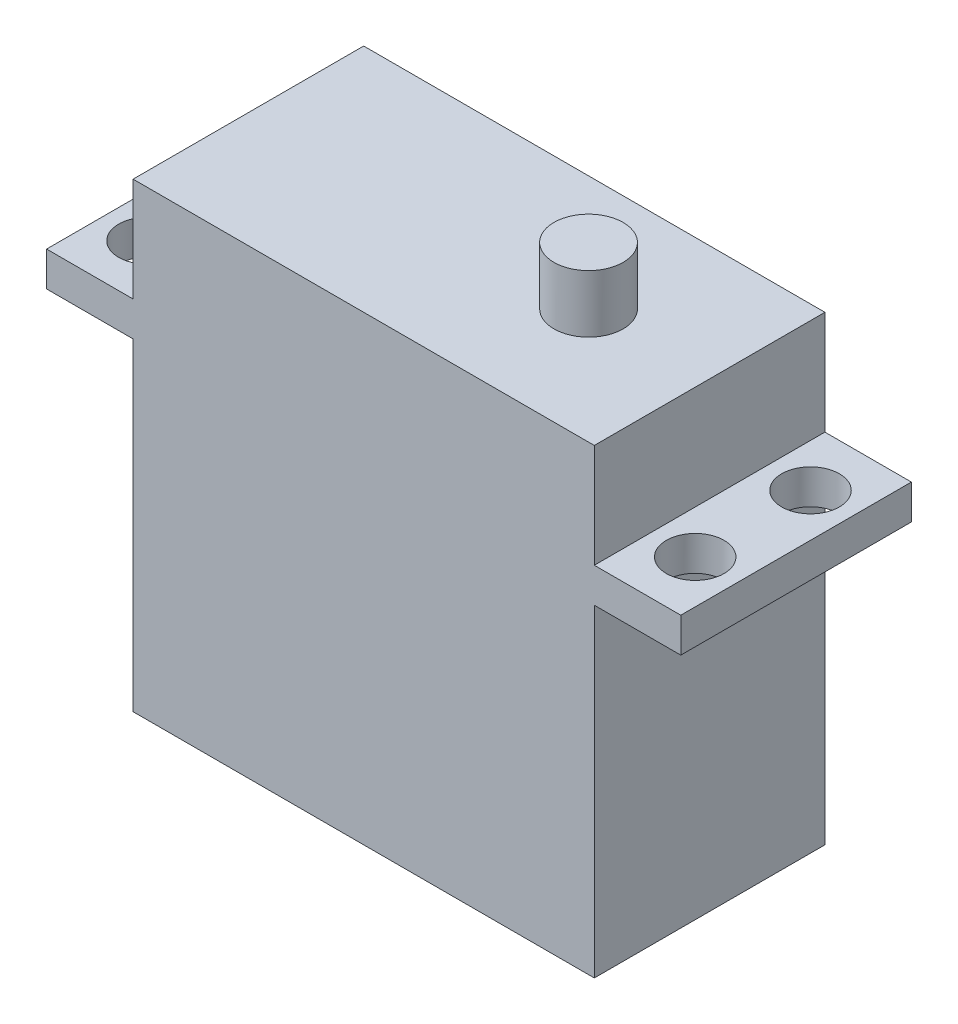
ISO-10303-21;
HEADER;
FILE_DESCRIPTION(('STEP AP214'),'2;1');
FILE_NAME('part.step','',(''),(''),'','','');
FILE_SCHEMA(('AUTOMOTIVE_DESIGN { 1 0 10303 214 1 1 1 1 }'));
ENDSEC;
DATA;
#1=APPLICATION_CONTEXT('core data for automotive mechanical design processes');
#2=APPLICATION_PROTOCOL_DEFINITION('international standard','automotive_design',2000,#1);
#3=PRODUCT_CONTEXT('',#1,'mechanical');
#4=PRODUCT('Part','Part','',(#3));
#5=PRODUCT_RELATED_PRODUCT_CATEGORY('part','',(#4));
#6=PRODUCT_DEFINITION_FORMATION('','',#4);
#7=PRODUCT_DEFINITION_CONTEXT('part definition',#1,'design');
#8=PRODUCT_DEFINITION('design','',#6,#7);
#9=PRODUCT_DEFINITION_SHAPE('','',#8);
#10=(LENGTH_UNIT() NAMED_UNIT(*) SI_UNIT(.MILLI.,.METRE.));
#11=(NAMED_UNIT(*) PLANE_ANGLE_UNIT() SI_UNIT($,.RADIAN.));
#12=(NAMED_UNIT(*) SI_UNIT($,.STERADIAN.) SOLID_ANGLE_UNIT());
#13=UNCERTAINTY_MEASURE_WITH_UNIT(LENGTH_MEASURE(1.E-05),#10,'distance_accuracy_value','');
#14=(GEOMETRIC_REPRESENTATION_CONTEXT(3) GLOBAL_UNCERTAINTY_ASSIGNED_CONTEXT((#13)) GLOBAL_UNIT_ASSIGNED_CONTEXT((#10,
#11,#12)) REPRESENTATION_CONTEXT('',''));
#15=CARTESIAN_POINT('',(0.,0.,0.));
#16=DIRECTION('',(0.,0.,1.));
#17=DIRECTION('',(1.,0.,0.));
#18=AXIS2_PLACEMENT_3D('',#15,#16,#17);
#19=CARTESIAN_POINT('',(20.,-20.,20.));
#20=DIRECTION('',(-1.,0.,0.));
#21=DIRECTION('',(0.,0.,1.));
#22=AXIS2_PLACEMENT_3D('',#19,#20,#21);
#23=PLANE('',#22);
#24=DIRECTION('',(0.,1.,0.));
#25=VECTOR('',#24,1.);
#26=CARTESIAN_POINT('',(20.,-20.,0.));
#27=LINE('',#26,#25);
#28=CARTESIAN_POINT('',(20.,-20.,0.));
#29=VERTEX_POINT('',#28);
#30=CARTESIAN_POINT('',(20.,8.,0.));
#31=VERTEX_POINT('',#30);
#32=EDGE_CURVE('E253',#29,#31,#27,.T.);
#33=ORIENTED_EDGE('',*,*,#32,.T.);
#34=DIRECTION('',(0.,0.,1.));
#35=VECTOR('',#34,1.);
#36=CARTESIAN_POINT('',(20.,8.,0.));
#37=LINE('',#36,#35);
#38=CARTESIAN_POINT('',(20.,8.,20.));
#39=VERTEX_POINT('',#38);
#40=EDGE_CURVE('E157',#31,#39,#37,.T.);
#41=ORIENTED_EDGE('',*,*,#40,.T.);
#42=DIRECTION('',(0.,1.,0.));
#43=VECTOR('',#42,1.);
#44=CARTESIAN_POINT('',(20.,-20.,20.));
#45=LINE('',#44,#43);
#46=CARTESIAN_POINT('',(20.,-20.,20.));
#47=VERTEX_POINT('',#46);
#48=EDGE_CURVE('E237',#47,#39,#45,.T.);
#49=ORIENTED_EDGE('',*,*,#48,.F.);
#50=DIRECTION('',(0.,0.,-1.));
#51=VECTOR('',#50,1.);
#52=CARTESIAN_POINT('',(20.,-20.,20.));
#53=LINE('',#52,#51);
#54=EDGE_CURVE('E252',#47,#29,#53,.T.);
#55=ORIENTED_EDGE('',*,*,#54,.T.);
#56=EDGE_LOOP('',(#33,#41,#49,#55));
#57=FACE_BOUND('',#56,.T.);
#58=ADVANCED_FACE('F43',(#57),#23,.F.);
#59=CARTESIAN_POINT('',(-20.,-20.,20.));
#60=DIRECTION('',(1.,0.,0.));
#61=DIRECTION('',(0.,0.,-1.));
#62=AXIS2_PLACEMENT_3D('',#59,#60,#61);
#63=PLANE('',#62);
#64=DIRECTION('',(0.,0.,-1.));
#65=VECTOR('',#64,1.);
#66=CARTESIAN_POINT('',(-20.,11.,0.));
#67=LINE('',#66,#65);
#68=CARTESIAN_POINT('',(-20.,11.,20.));
#69=VERTEX_POINT('',#68);
#70=CARTESIAN_POINT('',(-20.,11.,0.));
#71=VERTEX_POINT('',#70);
#72=EDGE_CURVE('E69',#69,#71,#67,.T.);
#73=ORIENTED_EDGE('',*,*,#72,.F.);
#74=DIRECTION('',(0.,-1.,0.));
#75=VECTOR('',#74,1.);
#76=CARTESIAN_POINT('',(-20.,-20.,20.));
#77=LINE('',#76,#75);
#78=CARTESIAN_POINT('',(-20.,20.,20.));
#79=VERTEX_POINT('',#78);
#80=EDGE_CURVE('E246',#79,#69,#77,.T.);
#81=ORIENTED_EDGE('',*,*,#80,.F.);
#82=DIRECTION('',(0.,0.,-1.));
#83=VECTOR('',#82,1.);
#84=CARTESIAN_POINT('',(-20.,20.,20.));
#85=LINE('',#84,#83);
#86=CARTESIAN_POINT('',(-20.,20.,0.));
#87=VERTEX_POINT('',#86);
#88=EDGE_CURVE('E274',#79,#87,#85,.T.);
#89=ORIENTED_EDGE('',*,*,#88,.T.);
#90=DIRECTION('',(0.,-1.,0.));
#91=VECTOR('',#90,1.);
#92=CARTESIAN_POINT('',(-20.,-20.,0.));
#93=LINE('',#92,#91);
#94=EDGE_CURVE('E261',#87,#71,#93,.T.);
#95=ORIENTED_EDGE('',*,*,#94,.T.);
#96=EDGE_LOOP('',(#73,#81,#89,#95));
#97=FACE_BOUND('',#96,.T.);
#98=ADVANCED_FACE('F313',(#97),#63,.F.);
#99=DIRECTION('',(0.,0.,1.));
#100=VECTOR('',#99,1.);
#101=CARTESIAN_POINT('',(-20.,8.,0.));
#102=LINE('',#101,#100);
#103=CARTESIAN_POINT('',(-20.,8.,0.));
#104=VERTEX_POINT('',#103);
#105=CARTESIAN_POINT('',(-20.,8.,20.));
#106=VERTEX_POINT('',#105);
#107=EDGE_CURVE('E198',#104,#106,#102,.T.);
#108=ORIENTED_EDGE('',*,*,#107,.F.);
#109=CARTESIAN_POINT('',(-20.,-20.,0.));
#110=VERTEX_POINT('',#109);
#111=EDGE_CURVE('E260',#104,#110,#93,.T.);
#112=ORIENTED_EDGE('',*,*,#111,.T.);
#113=DIRECTION('',(0.,0.,-1.));
#114=VECTOR('',#113,1.);
#115=CARTESIAN_POINT('',(-20.,-20.,20.));
#116=LINE('',#115,#114);
#117=CARTESIAN_POINT('',(-20.,-20.,20.));
#118=VERTEX_POINT('',#117);
#119=EDGE_CURVE('E270',#118,#110,#116,.T.);
#120=ORIENTED_EDGE('',*,*,#119,.F.);
#121=EDGE_CURVE('E245',#106,#118,#77,.T.);
#122=ORIENTED_EDGE('',*,*,#121,.F.);
#123=EDGE_LOOP('',(#108,#112,#120,#122));
#124=FACE_BOUND('',#123,.T.);
#125=ADVANCED_FACE('F318',(#124),#63,.F.);
#126=CARTESIAN_POINT('',(20.,11.,20.));
#127=VERTEX_POINT('',#126);
#128=CARTESIAN_POINT('',(20.,20.,20.));
#129=VERTEX_POINT('',#128);
#130=EDGE_CURVE('E242',#127,#129,#45,.T.);
#131=ORIENTED_EDGE('',*,*,#130,.F.);
#132=DIRECTION('',(0.,0.,-1.));
#133=VECTOR('',#132,1.);
#134=CARTESIAN_POINT('',(20.,11.,0.));
#135=LINE('',#134,#133);
#136=CARTESIAN_POINT('',(20.,11.,0.));
#137=VERTEX_POINT('',#136);
#138=EDGE_CURVE('E170',#127,#137,#135,.T.);
#139=ORIENTED_EDGE('',*,*,#138,.T.);
#140=CARTESIAN_POINT('',(20.,20.,0.));
#141=VERTEX_POINT('',#140);
#142=EDGE_CURVE('E143',#137,#141,#27,.T.);
#143=ORIENTED_EDGE('',*,*,#142,.T.);
#144=DIRECTION('',(0.,0.,-1.));
#145=VECTOR('',#144,1.);
#146=CARTESIAN_POINT('',(20.,20.,20.));
#147=LINE('',#146,#145);
#148=EDGE_CURVE('E53',#129,#141,#147,.T.);
#149=ORIENTED_EDGE('',*,*,#148,.F.);
#150=EDGE_LOOP('',(#131,#139,#143,#149));
#151=FACE_BOUND('',#150,.T.);
#152=ADVANCED_FACE('F45',(#151),#23,.F.);
#153=CARTESIAN_POINT('',(-20.,20.,20.));
#154=DIRECTION('',(0.,-1.,0.));
#155=DIRECTION('',(0.,0.,-1.));
#156=AXIS2_PLACEMENT_3D('',#153,#154,#155);
#157=PLANE('',#156);
#158=CARTESIAN_POINT('',(9.5,20.,10.));
#159=DIRECTION('',(0.,-1.,0.));
#160=DIRECTION('',(0.,0.,-1.));
#161=AXIS2_PLACEMENT_3D('',#158,#159,#160);
#162=CIRCLE('',#161,3.);
#163=CARTESIAN_POINT('',(9.5,20.,7.));
#164=VERTEX_POINT('',#163);
#165=EDGE_CURVE('E11',#164,#164,#162,.F.);
#166=ORIENTED_EDGE('',*,*,#165,.F.);
#167=EDGE_LOOP('',(#166));
#168=FACE_BOUND('',#167,.T.);
#169=DIRECTION('',(-1.,0.,0.));
#170=VECTOR('',#169,1.);
#171=CARTESIAN_POINT('',(-20.,20.,0.));
#172=LINE('',#171,#170);
#173=EDGE_CURVE('E257',#141,#87,#172,.T.);
#174=ORIENTED_EDGE('',*,*,#173,.T.);
#175=ORIENTED_EDGE('',*,*,#88,.F.);
#176=DIRECTION('',(-1.,0.,0.));
#177=VECTOR('',#176,1.);
#178=CARTESIAN_POINT('',(-20.,20.,20.));
#179=LINE('',#178,#177);
#180=EDGE_CURVE('E241',#129,#79,#179,.T.);
#181=ORIENTED_EDGE('',*,*,#180,.F.);
#182=ORIENTED_EDGE('',*,*,#148,.T.);
#183=EDGE_LOOP('',(#174,#175,#181,#182));
#184=FACE_BOUND('',#183,.T.);
#185=ADVANCED_FACE('F321',(#168,#184),#157,.F.);
#186=CARTESIAN_POINT('',(-20.,-20.,20.));
#187=DIRECTION('',(0.,1.,0.));
#188=DIRECTION('',(0.,0.,1.));
#189=AXIS2_PLACEMENT_3D('',#186,#187,#188);
#190=PLANE('',#189);
#191=DIRECTION('',(1.,0.,0.));
#192=VECTOR('',#191,1.);
#193=CARTESIAN_POINT('',(-20.,-20.,0.));
#194=LINE('',#193,#192);
#195=EDGE_CURVE('E264',#110,#29,#194,.T.);
#196=ORIENTED_EDGE('',*,*,#195,.T.);
#197=ORIENTED_EDGE('',*,*,#54,.F.);
#198=DIRECTION('',(1.,0.,0.));
#199=VECTOR('',#198,1.);
#200=CARTESIAN_POINT('',(-20.,-20.,20.));
#201=LINE('',#200,#199);
#202=EDGE_CURVE('E249',#118,#47,#201,.T.);
#203=ORIENTED_EDGE('',*,*,#202,.F.);
#204=ORIENTED_EDGE('',*,*,#119,.T.);
#205=EDGE_LOOP('',(#196,#197,#203,#204));
#206=FACE_BOUND('',#205,.T.);
#207=ADVANCED_FACE('F327',(#206),#190,.F.);
#208=CARTESIAN_POINT('',(0.,0.,20.));
#209=DIRECTION('',(0.,0.,-1.));
#210=DIRECTION('',(-1.,0.,0.));
#211=AXIS2_PLACEMENT_3D('',#208,#209,#210);
#212=PLANE('',#211);
#213=ORIENTED_EDGE('',*,*,#48,.T.);
#214=DIRECTION('',(-1.,0.,0.));
#215=VECTOR('',#214,1.);
#216=CARTESIAN_POINT('',(27.5,8.,20.));
#217=LINE('',#216,#215);
#218=CARTESIAN_POINT('',(27.5,8.,20.));
#219=VERTEX_POINT('',#218);
#220=EDGE_CURVE('E178',#219,#39,#217,.T.);
#221=ORIENTED_EDGE('',*,*,#220,.F.);
#222=DIRECTION('',(0.,1.,0.));
#223=VECTOR('',#222,1.);
#224=CARTESIAN_POINT('',(27.5,11.,20.));
#225=LINE('',#224,#223);
#226=CARTESIAN_POINT('',(27.5,11.,20.));
#227=VERTEX_POINT('',#226);
#228=EDGE_CURVE('E161',#219,#227,#225,.T.);
#229=ORIENTED_EDGE('',*,*,#228,.T.);
#230=DIRECTION('',(-1.,0.,0.));
#231=VECTOR('',#230,1.);
#232=CARTESIAN_POINT('',(27.5,11.,20.));
#233=LINE('',#232,#231);
#234=EDGE_CURVE('E146',#227,#127,#233,.T.);
#235=ORIENTED_EDGE('',*,*,#234,.T.);
#236=ORIENTED_EDGE('',*,*,#130,.T.);
#237=ORIENTED_EDGE('',*,*,#180,.T.);
#238=ORIENTED_EDGE('',*,*,#80,.T.);
#239=DIRECTION('',(1.,0.,0.));
#240=VECTOR('',#239,1.);
#241=CARTESIAN_POINT('',(-27.5,11.,20.));
#242=LINE('',#241,#240);
#243=CARTESIAN_POINT('',(-27.5,11.,20.));
#244=VERTEX_POINT('',#243);
#245=EDGE_CURVE('E221',#244,#69,#242,.T.);
#246=ORIENTED_EDGE('',*,*,#245,.F.);
#247=DIRECTION('',(0.,1.,0.));
#248=VECTOR('',#247,1.);
#249=CARTESIAN_POINT('',(-27.5,11.,20.));
#250=LINE('',#249,#248);
#251=CARTESIAN_POINT('',(-27.5,8.,20.));
#252=VERTEX_POINT('',#251);
#253=EDGE_CURVE('E206',#252,#244,#250,.T.);
#254=ORIENTED_EDGE('',*,*,#253,.F.);
#255=DIRECTION('',(1.,0.,0.));
#256=VECTOR('',#255,1.);
#257=CARTESIAN_POINT('',(-27.5,8.,20.));
#258=LINE('',#257,#256);
#259=EDGE_CURVE('E225',#252,#106,#258,.T.);
#260=ORIENTED_EDGE('',*,*,#259,.T.);
#261=ORIENTED_EDGE('',*,*,#121,.T.);
#262=ORIENTED_EDGE('',*,*,#202,.T.);
#263=EDGE_LOOP('',(#213,#221,#229,#235,#236,#237,#238,#246,#254,#260,#261,#262));
#264=FACE_BOUND('',#263,.T.);
#265=ADVANCED_FACE('F340',(#264),#212,.F.);
#266=CARTESIAN_POINT('',(0.,0.,0.));
#267=DIRECTION('',(0.,0.,-1.));
#268=DIRECTION('',(-1.,0.,0.));
#269=AXIS2_PLACEMENT_3D('',#266,#267,#268);
#270=PLANE('',#269);
#271=ORIENTED_EDGE('',*,*,#32,.F.);
#272=ORIENTED_EDGE('',*,*,#195,.F.);
#273=ORIENTED_EDGE('',*,*,#111,.F.);
#274=DIRECTION('',(1.,0.,0.));
#275=VECTOR('',#274,1.);
#276=CARTESIAN_POINT('',(-27.5,8.,0.));
#277=LINE('',#276,#275);
#278=CARTESIAN_POINT('',(-27.5,8.,0.));
#279=VERTEX_POINT('',#278);
#280=EDGE_CURVE('E229',#279,#104,#277,.T.);
#281=ORIENTED_EDGE('',*,*,#280,.F.);
#282=DIRECTION('',(0.,-1.,0.));
#283=VECTOR('',#282,1.);
#284=CARTESIAN_POINT('',(-27.5,11.,0.));
#285=LINE('',#284,#283);
#286=CARTESIAN_POINT('',(-27.5,11.,0.));
#287=VERTEX_POINT('',#286);
#288=EDGE_CURVE('E199',#287,#279,#285,.T.);
#289=ORIENTED_EDGE('',*,*,#288,.F.);
#290=DIRECTION('',(1.,0.,0.));
#291=VECTOR('',#290,1.);
#292=CARTESIAN_POINT('',(-27.5,11.,0.));
#293=LINE('',#292,#291);
#294=EDGE_CURVE('E212',#287,#71,#293,.T.);
#295=ORIENTED_EDGE('',*,*,#294,.T.);
#296=ORIENTED_EDGE('',*,*,#94,.F.);
#297=ORIENTED_EDGE('',*,*,#173,.F.);
#298=ORIENTED_EDGE('',*,*,#142,.F.);
#299=DIRECTION('',(-1.,0.,0.));
#300=VECTOR('',#299,1.);
#301=CARTESIAN_POINT('',(27.5,11.,0.));
#302=LINE('',#301,#300);
#303=CARTESIAN_POINT('',(27.5,11.,0.));
#304=VERTEX_POINT('',#303);
#305=EDGE_CURVE('E61',#304,#137,#302,.T.);
#306=ORIENTED_EDGE('',*,*,#305,.F.);
#307=DIRECTION('',(0.,-1.,0.));
#308=VECTOR('',#307,1.);
#309=CARTESIAN_POINT('',(27.5,11.,0.));
#310=LINE('',#309,#308);
#311=CARTESIAN_POINT('',(27.5,8.,0.));
#312=VERTEX_POINT('',#311);
#313=EDGE_CURVE('E140',#304,#312,#310,.T.);
#314=ORIENTED_EDGE('',*,*,#313,.T.);
#315=DIRECTION('',(-1.,0.,0.));
#316=VECTOR('',#315,1.);
#317=CARTESIAN_POINT('',(27.5,8.,0.));
#318=LINE('',#317,#316);
#319=EDGE_CURVE('E169',#312,#31,#318,.T.);
#320=ORIENTED_EDGE('',*,*,#319,.T.);
#321=EDGE_LOOP('',(#271,#272,#273,#281,#289,#295,#296,#297,#298,#306,#314,#320));
#322=FACE_BOUND('',#321,.T.);
#323=ADVANCED_FACE('F139',(#322),#270,.T.);
#324=CARTESIAN_POINT('',(9.5,25.,10.));
#325=DIRECTION('',(0.,-1.,0.));
#326=DIRECTION('',(0.,0.,-1.));
#327=AXIS2_PLACEMENT_3D('',#324,#325,#326);
#328=CYLINDRICAL_SURFACE('',#327,3.);
#329=CARTESIAN_POINT('',(9.5,25.,10.));
#330=DIRECTION('',(0.,1.,0.));
#331=DIRECTION('',(0.,0.,1.));
#332=AXIS2_PLACEMENT_3D('',#329,#330,#331);
#333=CIRCLE('',#332,3.);
#334=CARTESIAN_POINT('',(9.5,25.,13.));
#335=VERTEX_POINT('',#334);
#336=EDGE_CURVE('E233',#335,#335,#333,.T.);
#337=ORIENTED_EDGE('',*,*,#336,.F.);
#338=EDGE_LOOP('',(#337));
#339=FACE_BOUND('',#338,.T.);
#340=ORIENTED_EDGE('',*,*,#165,.T.);
#341=EDGE_LOOP('',(#340));
#342=FACE_BOUND('',#341,.T.);
#343=ADVANCED_FACE('F390',(#339,#342),#328,.T.);
#344=CARTESIAN_POINT('',(9.5,25.,10.));
#345=DIRECTION('',(0.,1.,0.));
#346=DIRECTION('',(0.,0.,1.));
#347=AXIS2_PLACEMENT_3D('',#344,#345,#346);
#348=PLANE('',#347);
#349=ORIENTED_EDGE('',*,*,#336,.T.);
#350=EDGE_LOOP('',(#349));
#351=FACE_BOUND('',#350,.T.);
#352=ADVANCED_FACE('F386',(#351),#348,.T.);
#353=CARTESIAN_POINT('',(-27.5,8.,0.));
#354=DIRECTION('',(0.,1.,0.));
#355=DIRECTION('',(0.,0.,1.));
#356=AXIS2_PLACEMENT_3D('',#353,#354,#355);
#357=PLANE('',#356);
#358=CARTESIAN_POINT('',(-23.75,8.,5.));
#359=DIRECTION('',(0.,1.,0.));
#360=DIRECTION('',(0.,0.,1.));
#361=AXIS2_PLACEMENT_3D('',#358,#359,#360);
#362=CIRCLE('',#361,2.5);
#363=CARTESIAN_POINT('',(-23.75,8.,7.5));
#364=VERTEX_POINT('',#363);
#365=EDGE_CURVE('E194',#364,#364,#362,.T.);
#366=ORIENTED_EDGE('',*,*,#365,.T.);
#367=EDGE_LOOP('',(#366));
#368=FACE_BOUND('',#367,.T.);
#369=CARTESIAN_POINT('',(-23.75,8.,15.));
#370=DIRECTION('',(0.,1.,0.));
#371=DIRECTION('',(0.,0.,1.));
#372=AXIS2_PLACEMENT_3D('',#369,#370,#371);
#373=CIRCLE('',#372,2.5);
#374=CARTESIAN_POINT('',(-23.75,8.,17.5));
#375=VERTEX_POINT('',#374);
#376=EDGE_CURVE('E187',#375,#375,#373,.T.);
#377=ORIENTED_EDGE('',*,*,#376,.T.);
#378=EDGE_LOOP('',(#377));
#379=FACE_BOUND('',#378,.T.);
#380=ORIENTED_EDGE('',*,*,#107,.T.);
#381=ORIENTED_EDGE('',*,*,#259,.F.);
#382=DIRECTION('',(0.,0.,1.));
#383=VECTOR('',#382,1.);
#384=CARTESIAN_POINT('',(-27.5,8.,0.));
#385=LINE('',#384,#383);
#386=EDGE_CURVE('E203',#279,#252,#385,.T.);
#387=ORIENTED_EDGE('',*,*,#386,.F.);
#388=ORIENTED_EDGE('',*,*,#280,.T.);
#389=EDGE_LOOP('',(#380,#381,#387,#388));
#390=FACE_BOUND('',#389,.T.);
#391=ADVANCED_FACE('F354',(#368,#379,#390),#357,.F.);
#392=CARTESIAN_POINT('',(-27.5,11.,0.));
#393=DIRECTION('',(0.,-1.,0.));
#394=DIRECTION('',(0.,0.,-1.));
#395=AXIS2_PLACEMENT_3D('',#392,#393,#394);
#396=PLANE('',#395);
#397=CARTESIAN_POINT('',(-23.75,11.,5.));
#398=DIRECTION('',(0.,1.,0.));
#399=DIRECTION('',(0.,0.,1.));
#400=AXIS2_PLACEMENT_3D('',#397,#398,#399);
#401=CIRCLE('',#400,2.5);
#402=CARTESIAN_POINT('',(-23.75,11.,7.5));
#403=VERTEX_POINT('',#402);
#404=EDGE_CURVE('E183',#403,#403,#401,.T.);
#405=ORIENTED_EDGE('',*,*,#404,.F.);
#406=EDGE_LOOP('',(#405));
#407=FACE_BOUND('',#406,.T.);
#408=CARTESIAN_POINT('',(-23.75,11.,15.));
#409=DIRECTION('',(0.,1.,0.));
#410=DIRECTION('',(0.,0.,1.));
#411=AXIS2_PLACEMENT_3D('',#408,#409,#410);
#412=CIRCLE('',#411,2.5);
#413=CARTESIAN_POINT('',(-23.75,11.,17.5));
#414=VERTEX_POINT('',#413);
#415=EDGE_CURVE('E145',#414,#414,#412,.T.);
#416=ORIENTED_EDGE('',*,*,#415,.F.);
#417=EDGE_LOOP('',(#416));
#418=FACE_BOUND('',#417,.T.);
#419=ORIENTED_EDGE('',*,*,#72,.T.);
#420=ORIENTED_EDGE('',*,*,#294,.F.);
#421=DIRECTION('',(0.,0.,-1.));
#422=VECTOR('',#421,1.);
#423=CARTESIAN_POINT('',(-27.5,11.,0.));
#424=LINE('',#423,#422);
#425=EDGE_CURVE('E209',#244,#287,#424,.T.);
#426=ORIENTED_EDGE('',*,*,#425,.F.);
#427=ORIENTED_EDGE('',*,*,#245,.T.);
#428=EDGE_LOOP('',(#419,#420,#426,#427));
#429=FACE_BOUND('',#428,.T.);
#430=ADVANCED_FACE('F345',(#407,#418,#429),#396,.F.);
#431=CARTESIAN_POINT('',(-27.5,0.,0.));
#432=DIRECTION('',(-1.,0.,0.));
#433=DIRECTION('',(0.,0.,1.));
#434=AXIS2_PLACEMENT_3D('',#431,#432,#433);
#435=PLANE('',#434);
#436=ORIENTED_EDGE('',*,*,#288,.T.);
#437=ORIENTED_EDGE('',*,*,#386,.T.);
#438=ORIENTED_EDGE('',*,*,#253,.T.);
#439=ORIENTED_EDGE('',*,*,#425,.T.);
#440=EDGE_LOOP('',(#436,#437,#438,#439));
#441=FACE_BOUND('',#440,.T.);
#442=ADVANCED_FACE('F349',(#441),#435,.T.);
#443=CARTESIAN_POINT('',(-23.75,3.5,15.));
#444=DIRECTION('',(0.,1.,0.));
#445=DIRECTION('',(0.,0.,1.));
#446=AXIS2_PLACEMENT_3D('',#443,#444,#445);
#447=CYLINDRICAL_SURFACE('',#446,2.5);
#448=ORIENTED_EDGE('',*,*,#415,.T.);
#449=EDGE_LOOP('',(#448));
#450=FACE_BOUND('',#449,.T.);
#451=ORIENTED_EDGE('',*,*,#376,.F.);
#452=EDGE_LOOP('',(#451));
#453=FACE_BOUND('',#452,.T.);
#454=ADVANCED_FACE('F374',(#450,#453),#447,.F.);
#455=CARTESIAN_POINT('',(-23.75,3.5,5.));
#456=DIRECTION('',(0.,1.,0.));
#457=DIRECTION('',(0.,0.,1.));
#458=AXIS2_PLACEMENT_3D('',#455,#456,#457);
#459=CYLINDRICAL_SURFACE('',#458,2.5);
#460=ORIENTED_EDGE('',*,*,#404,.T.);
#461=EDGE_LOOP('',(#460));
#462=FACE_BOUND('',#461,.T.);
#463=ORIENTED_EDGE('',*,*,#365,.F.);
#464=EDGE_LOOP('',(#463));
#465=FACE_BOUND('',#464,.T.);
#466=ADVANCED_FACE('F369',(#462,#465),#459,.F.);
#467=CARTESIAN_POINT('',(27.5,11.,0.));
#468=DIRECTION('',(0.,1.,0.));
#469=DIRECTION('',(0.,0.,1.));
#470=AXIS2_PLACEMENT_3D('',#467,#468,#469);
#471=PLANE('',#470);
#472=CARTESIAN_POINT('',(23.75,11.,5.));
#473=DIRECTION('',(0.,-1.,0.));
#474=DIRECTION('',(0.,0.,1.));
#475=AXIS2_PLACEMENT_3D('',#472,#473,#474);
#476=CIRCLE('',#475,2.5);
#477=CARTESIAN_POINT('',(23.75,11.,7.5));
#478=VERTEX_POINT('',#477);
#479=EDGE_CURVE('E283',#478,#478,#476,.T.);
#480=ORIENTED_EDGE('',*,*,#479,.T.);
#481=EDGE_LOOP('',(#480));
#482=FACE_BOUND('',#481,.T.);
#483=CARTESIAN_POINT('',(23.75,11.,15.));
#484=DIRECTION('',(0.,-1.,0.));
#485=DIRECTION('',(0.,0.,1.));
#486=AXIS2_PLACEMENT_3D('',#483,#484,#485);
#487=CIRCLE('',#486,2.5);
#488=CARTESIAN_POINT('',(23.75,11.,17.5));
#489=VERTEX_POINT('',#488);
#490=EDGE_CURVE('E290',#489,#489,#487,.T.);
#491=ORIENTED_EDGE('',*,*,#490,.T.);
#492=EDGE_LOOP('',(#491));
#493=FACE_BOUND('',#492,.T.);
#494=ORIENTED_EDGE('',*,*,#138,.F.);
#495=ORIENTED_EDGE('',*,*,#234,.F.);
#496=DIRECTION('',(0.,0.,-1.));
#497=VECTOR('',#496,1.);
#498=CARTESIAN_POINT('',(27.5,11.,0.));
#499=LINE('',#498,#497);
#500=EDGE_CURVE('E152',#227,#304,#499,.T.);
#501=ORIENTED_EDGE('',*,*,#500,.T.);
#502=ORIENTED_EDGE('',*,*,#305,.T.);
#503=EDGE_LOOP('',(#494,#495,#501,#502));
#504=FACE_BOUND('',#503,.T.);
#505=ADVANCED_FACE('F159',(#482,#493,#504),#471,.T.);
#506=CARTESIAN_POINT('',(27.5,8.,0.));
#507=DIRECTION('',(0.,-1.,0.));
#508=DIRECTION('',(0.,0.,-1.));
#509=AXIS2_PLACEMENT_3D('',#506,#507,#508);
#510=PLANE('',#509);
#511=CARTESIAN_POINT('',(23.75,8.,5.));
#512=DIRECTION('',(0.,-1.,0.));
#513=DIRECTION('',(0.,0.,-1.));
#514=AXIS2_PLACEMENT_3D('',#511,#512,#513);
#515=CIRCLE('',#514,2.5);
#516=CARTESIAN_POINT('',(23.75,8.,2.5));
#517=VERTEX_POINT('',#516);
#518=EDGE_CURVE('E47',#517,#517,#515,.F.);
#519=ORIENTED_EDGE('',*,*,#518,.T.);
#520=EDGE_LOOP('',(#519));
#521=FACE_BOUND('',#520,.T.);
#522=CARTESIAN_POINT('',(23.75,8.,15.));
#523=DIRECTION('',(0.,-1.,0.));
#524=DIRECTION('',(0.,0.,-1.));
#525=AXIS2_PLACEMENT_3D('',#522,#523,#524);
#526=CIRCLE('',#525,2.5);
#527=CARTESIAN_POINT('',(23.75,8.,12.5));
#528=VERTEX_POINT('',#527);
#529=EDGE_CURVE('E280',#528,#528,#526,.F.);
#530=ORIENTED_EDGE('',*,*,#529,.T.);
#531=EDGE_LOOP('',(#530));
#532=FACE_BOUND('',#531,.T.);
#533=ORIENTED_EDGE('',*,*,#40,.F.);
#534=ORIENTED_EDGE('',*,*,#319,.F.);
#535=DIRECTION('',(0.,0.,1.));
#536=VECTOR('',#535,1.);
#537=CARTESIAN_POINT('',(27.5,8.,0.));
#538=LINE('',#537,#536);
#539=EDGE_CURVE('E155',#312,#219,#538,.T.);
#540=ORIENTED_EDGE('',*,*,#539,.T.);
#541=ORIENTED_EDGE('',*,*,#220,.T.);
#542=EDGE_LOOP('',(#533,#534,#540,#541));
#543=FACE_BOUND('',#542,.T.);
#544=ADVANCED_FACE('F310',(#521,#532,#543),#510,.T.);
#545=CARTESIAN_POINT('',(27.5,0.,0.));
#546=DIRECTION('',(1.,0.,0.));
#547=DIRECTION('',(0.,0.,1.));
#548=AXIS2_PLACEMENT_3D('',#545,#546,#547);
#549=PLANE('',#548);
#550=ORIENTED_EDGE('',*,*,#313,.F.);
#551=ORIENTED_EDGE('',*,*,#500,.F.);
#552=ORIENTED_EDGE('',*,*,#228,.F.);
#553=ORIENTED_EDGE('',*,*,#539,.F.);
#554=EDGE_LOOP('',(#550,#551,#552,#553));
#555=FACE_BOUND('',#554,.T.);
#556=ADVANCED_FACE('F150',(#555),#549,.T.);
#557=CARTESIAN_POINT('',(23.75,3.5,15.));
#558=DIRECTION('',(0.,1.,0.));
#559=DIRECTION('',(0.,0.,1.));
#560=AXIS2_PLACEMENT_3D('',#557,#558,#559);
#561=CYLINDRICAL_SURFACE('',#560,2.5);
#562=ORIENTED_EDGE('',*,*,#529,.F.);
#563=EDGE_LOOP('',(#562));
#564=FACE_BOUND('',#563,.T.);
#565=ORIENTED_EDGE('',*,*,#490,.F.);
#566=EDGE_LOOP('',(#565));
#567=FACE_BOUND('',#566,.T.);
#568=ADVANCED_FACE('F299',(#564,#567),#561,.F.);
#569=CARTESIAN_POINT('',(23.75,3.5,5.));
#570=DIRECTION('',(0.,1.,0.));
#571=DIRECTION('',(0.,0.,1.));
#572=AXIS2_PLACEMENT_3D('',#569,#570,#571);
#573=CYLINDRICAL_SURFACE('',#572,2.5);
#574=ORIENTED_EDGE('',*,*,#518,.F.);
#575=EDGE_LOOP('',(#574));
#576=FACE_BOUND('',#575,.T.);
#577=ORIENTED_EDGE('',*,*,#479,.F.);
#578=EDGE_LOOP('',(#577));
#579=FACE_BOUND('',#578,.T.);
#580=ADVANCED_FACE('F301',(#576,#579),#573,.F.);
#581=CLOSED_SHELL('',(#58,#98,#125,#152,#185,#207,#265,#323,#343,#352,#391,#430,#442,#454,#466,
#505,#544,#556,#568,#580));
#582=MANIFOLD_SOLID_BREP('B2',#581);
#583=ADVANCED_BREP_SHAPE_REPRESENTATION('',(#18,#582),#14);
#584=SHAPE_DEFINITION_REPRESENTATION(#9,#583);
ENDSEC;
END-ISO-10303-21;
